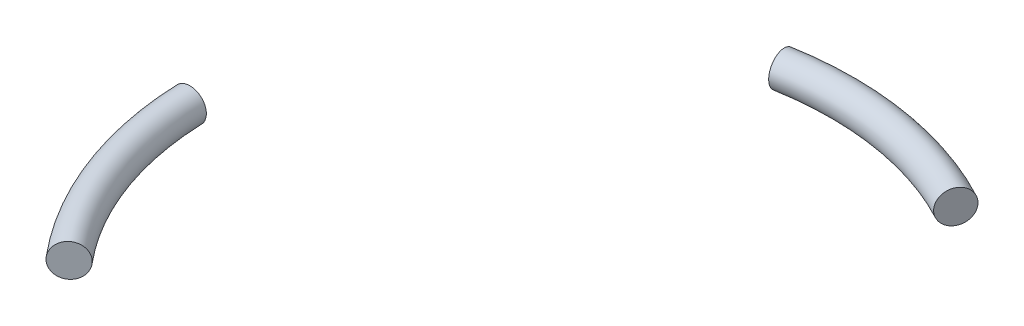
ISO-10303-21;
HEADER;
FILE_DESCRIPTION(('STEP AP214'),'2;1');
FILE_NAME('part.step','',(''),(''),'','','');
FILE_SCHEMA(('AUTOMOTIVE_DESIGN { 1 0 10303 214 1 1 1 1 }'));
ENDSEC;
DATA;
#1=APPLICATION_CONTEXT('core data for automotive mechanical design processes');
#2=APPLICATION_PROTOCOL_DEFINITION('international standard','automotive_design',2000,#1);
#3=PRODUCT_CONTEXT('',#1,'mechanical');
#4=PRODUCT('Part','Part','',(#3));
#5=PRODUCT_RELATED_PRODUCT_CATEGORY('part','',(#4));
#6=PRODUCT_DEFINITION_FORMATION('','',#4);
#7=PRODUCT_DEFINITION_CONTEXT('part definition',#1,'design');
#8=PRODUCT_DEFINITION('design','',#6,#7);
#9=PRODUCT_DEFINITION_SHAPE('','',#8);
#10=(LENGTH_UNIT() NAMED_UNIT(*) SI_UNIT(.MILLI.,.METRE.));
#11=(NAMED_UNIT(*) PLANE_ANGLE_UNIT() SI_UNIT($,.RADIAN.));
#12=(NAMED_UNIT(*) SI_UNIT($,.STERADIAN.) SOLID_ANGLE_UNIT());
#13=UNCERTAINTY_MEASURE_WITH_UNIT(LENGTH_MEASURE(1.E-05),#10,'distance_accuracy_value','');
#14=(GEOMETRIC_REPRESENTATION_CONTEXT(3) GLOBAL_UNCERTAINTY_ASSIGNED_CONTEXT((#13)) GLOBAL_UNIT_ASSIGNED_CONTEXT((#10,
#11,#12)) REPRESENTATION_CONTEXT('',''));
#15=CARTESIAN_POINT('',(0.,0.,0.));
#16=DIRECTION('',(0.,0.,1.));
#17=DIRECTION('',(1.,0.,0.));
#18=AXIS2_PLACEMENT_3D('',#15,#16,#17);
#19=CARTESIAN_POINT('',(0.,5.,0.));
#20=DIRECTION('',(-0.984807753012206,0.,0.173648177666941));
#21=DIRECTION('',(0.173648177666941,0.,0.984807753012206));
#22=AXIS2_PLACEMENT_3D('',#19,#20,#21);
#23=PLANE('',#22);
#24=CARTESIAN_POINT('',(-1.35879699024381,0.7302,-7.70612066732051));
#25=DIRECTION('',(0.984807753012206,0.,-0.173648177666941));
#26=DIRECTION('',(0.173648177666941,0.,0.984807753012206));
#27=AXIS2_PLACEMENT_3D('',#24,#25,#26);
#28=CIRCLE('',#27,0.4);
#29=CARTESIAN_POINT('',(-1.42825626131059,0.7302,-8.1000437685254));
#30=VERTEX_POINT('',#29);
#31=EDGE_CURVE('P0_E18',#30,#30,#28,.T.);
#32=ORIENTED_EDGE('',*,*,#31,.F.);
#33=EDGE_LOOP('',(#32));
#34=FACE_BOUND('',#33,.T.);
#35=ADVANCED_FACE('P0_F15',(#34),#23,.T.);
#36=CARTESIAN_POINT('',(0.,5.,0.));
#37=DIRECTION('',(-0.882947592858931,0.,-0.469471562785883));
#38=DIRECTION('',(-0.469471562785883,0.,0.882947592858931));
#39=AXIS2_PLACEMENT_3D('',#36,#37,#38);
#40=PLANE('',#39);
#41=CARTESIAN_POINT('',(3.67361497879953,0.7302,-6.90906491412113));
#42=DIRECTION('',(0.882947592858931,0.,0.469471562785883));
#43=DIRECTION('',(-0.469471562785883,0.,0.882947592858931));
#44=AXIS2_PLACEMENT_3D('',#41,#42,#43);
#45=CIRCLE('',#44,0.4);
#46=CARTESIAN_POINT('',(3.86140360391389,0.7302,-7.26224395126471));
#47=VERTEX_POINT('',#46);
#48=EDGE_CURVE('P0_E10',#47,#47,#45,.T.);
#49=ORIENTED_EDGE('',*,*,#48,.T.);
#50=EDGE_LOOP('',(#49));
#51=FACE_BOUND('',#50,.T.);
#52=ADVANCED_FACE('P0_F36',(#51),#40,.F.);
#53=CARTESIAN_POINT('',(0.,0.7302,0.));
#54=DIRECTION('',(0.,-1.,0.));
#55=DIRECTION('',(-0.984807753012206,0.,0.173648177666941));
#56=AXIS2_PLACEMENT_3D('',#53,#54,#55);
#57=TOROIDAL_SURFACE('',#56,7.825,0.4);
#58=CARTESIAN_POINT('',(0.,0.7302,0.));
#59=DIRECTION('',(0.,-1.,0.));
#60=DIRECTION('',(-0.984807753012206,0.,0.173648177666941));
#61=AXIS2_PLACEMENT_3D('',#58,#59,#60);
#62=CIRCLE('',#61,8.225);
#63=EDGE_CURVE('',#30,#47,#62,.T.);
#64=ORIENTED_EDGE('',*,*,#31,.T.);
#65=ORIENTED_EDGE('',*,*,#48,.F.);
#66=ORIENTED_EDGE('',*,*,#63,.T.);
#67=ORIENTED_EDGE('',*,*,#63,.F.);
#68=EDGE_LOOP('',(#64,#66,#65,#67));
#69=FACE_BOUND('',#68,.T.);
#70=ADVANCED_FACE('P0_F33',(#69),#57,.T.);
#71=CLOSED_SHELL('',(#35,#52,#70));
#72=MANIFOLD_SOLID_BREP('P0_B1',#71);
#73=CARTESIAN_POINT('',(0.,5.,0.));
#74=DIRECTION('',(0.642787609686541,0.,0.766044443118977));
#75=DIRECTION('',(0.766044443118977,0.,-0.642787609686541));
#76=AXIS2_PLACEMENT_3D('',#73,#74,#75);
#77=PLANE('',#76);
#78=CARTESIAN_POINT('',(-5.994297767406,0.7302,5.02981304579718));
#79=DIRECTION('',(-0.642787609686541,0.,-0.766044443118977));
#80=DIRECTION('',(0.766044443118977,0.,-0.642787609686541));
#81=AXIS2_PLACEMENT_3D('',#78,#79,#80);
#82=CIRCLE('',#81,0.4);
#83=CARTESIAN_POINT('',(-6.30071554465359,0.7302,5.28692808967179));
#84=VERTEX_POINT('',#83);
#85=EDGE_CURVE('P1_E18',#84,#84,#82,.T.);
#86=ORIENTED_EDGE('',*,*,#85,.F.);
#87=EDGE_LOOP('',(#86));
#88=FACE_BOUND('',#87,.T.);
#89=ADVANCED_FACE('P1_F15',(#88),#77,.T.);
#90=CARTESIAN_POINT('',(0.,5.,0.));
#91=DIRECTION('',(0.0348994967025009,0.,0.999390827019096));
#92=DIRECTION('',(0.999390827019096,0.,-0.0348994967025009));
#93=AXIS2_PLACEMENT_3D('',#90,#91,#92);
#94=PLANE('',#93);
#95=CARTESIAN_POINT('',(-7.82023322142443,0.7302,0.27308856169707));
#96=DIRECTION('',(-0.0348994967025009,0.,-0.999390827019096));
#97=DIRECTION('',(0.999390827019096,0.,-0.034899496702501));
#98=AXIS2_PLACEMENT_3D('',#95,#96,#97);
#99=CIRCLE('',#98,0.4);
#100=CARTESIAN_POINT('',(-8.21998955223206,0.7302,0.287048360378071));
#101=VERTEX_POINT('',#100);
#102=EDGE_CURVE('P1_E10',#101,#101,#99,.T.);
#103=ORIENTED_EDGE('',*,*,#102,.T.);
#104=EDGE_LOOP('',(#103));
#105=FACE_BOUND('',#104,.T.);
#106=ADVANCED_FACE('P1_F36',(#105),#94,.F.);
#107=CARTESIAN_POINT('',(0.,0.7302,0.));
#108=DIRECTION('',(0.,-1.,0.));
#109=DIRECTION('',(0.642787609686541,0.,0.766044443118977));
#110=AXIS2_PLACEMENT_3D('',#107,#108,#109);
#111=TOROIDAL_SURFACE('',#110,7.825,0.4);
#112=CARTESIAN_POINT('',(0.,0.7302,0.));
#113=DIRECTION('',(0.,-1.,0.));
#114=DIRECTION('',(0.642787609686541,0.,0.766044443118977));
#115=AXIS2_PLACEMENT_3D('',#112,#113,#114);
#116=CIRCLE('',#115,8.225);
#117=EDGE_CURVE('',#84,#101,#116,.T.);
#118=ORIENTED_EDGE('',*,*,#85,.T.);
#119=ORIENTED_EDGE('',*,*,#102,.F.);
#120=ORIENTED_EDGE('',*,*,#117,.T.);
#121=ORIENTED_EDGE('',*,*,#117,.F.);
#122=EDGE_LOOP('',(#118,#120,#119,#121));
#123=FACE_BOUND('',#122,.T.);
#124=ADVANCED_FACE('P1_F33',(#123),#111,.T.);
#125=CLOSED_SHELL('',(#89,#106,#124));
#126=MANIFOLD_SOLID_BREP('P1_B1',#125);
#127=ADVANCED_BREP_SHAPE_REPRESENTATION('',(#18,#72,#126),#14);
#128=SHAPE_DEFINITION_REPRESENTATION(#9,#127);
ENDSEC;
END-ISO-10303-21;
